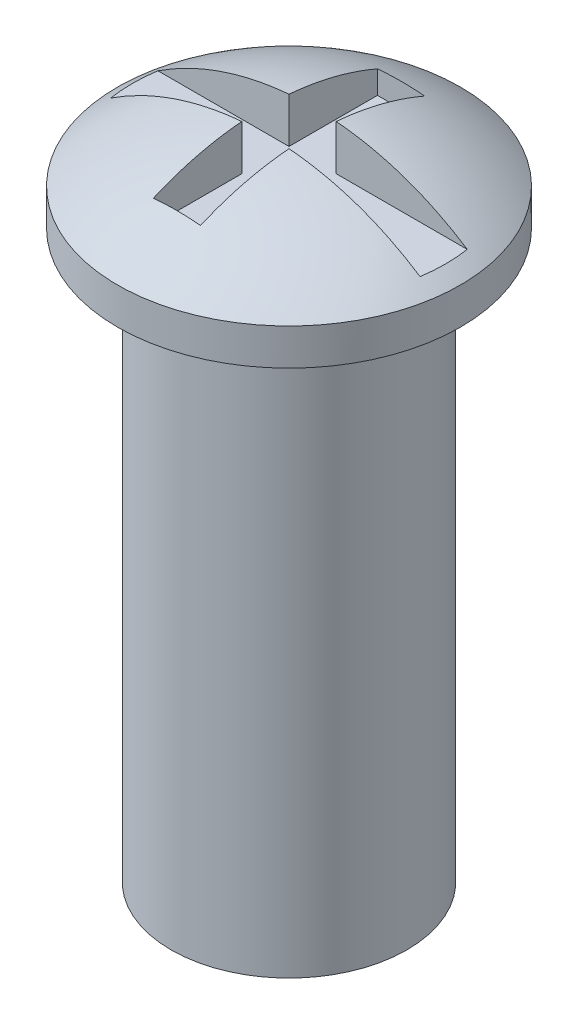
ISO-10303-21;
HEADER;
FILE_DESCRIPTION(('STEP AP214'),'2;1');
FILE_NAME('part.step','',(''),(''),'','','');
FILE_SCHEMA(('AUTOMOTIVE_DESIGN { 1 0 10303 214 1 1 1 1 }'));
ENDSEC;
DATA;
#1=APPLICATION_CONTEXT('core data for automotive mechanical design processes');
#2=APPLICATION_PROTOCOL_DEFINITION('international standard','automotive_design',2000,#1);
#3=PRODUCT_CONTEXT('',#1,'mechanical');
#4=PRODUCT('Part','Part','',(#3));
#5=PRODUCT_RELATED_PRODUCT_CATEGORY('part','',(#4));
#6=PRODUCT_DEFINITION_FORMATION('','',#4);
#7=PRODUCT_DEFINITION_CONTEXT('part definition',#1,'design');
#8=PRODUCT_DEFINITION('design','',#6,#7);
#9=PRODUCT_DEFINITION_SHAPE('','',#8);
#10=(LENGTH_UNIT() NAMED_UNIT(*) SI_UNIT(.MILLI.,.METRE.));
#11=(NAMED_UNIT(*) PLANE_ANGLE_UNIT() SI_UNIT($,.RADIAN.));
#12=(NAMED_UNIT(*) SI_UNIT($,.STERADIAN.) SOLID_ANGLE_UNIT());
#13=UNCERTAINTY_MEASURE_WITH_UNIT(LENGTH_MEASURE(1.E-05),#10,'distance_accuracy_value','');
#14=(GEOMETRIC_REPRESENTATION_CONTEXT(3) GLOBAL_UNCERTAINTY_ASSIGNED_CONTEXT((#13)) GLOBAL_UNIT_ASSIGNED_CONTEXT((#10,
#11,#12)) REPRESENTATION_CONTEXT('',''));
#15=CARTESIAN_POINT('',(0.,0.,0.));
#16=DIRECTION('',(0.,0.,1.));
#17=DIRECTION('',(1.,0.,0.));
#18=AXIS2_PLACEMENT_3D('',#15,#16,#17);
#19=CARTESIAN_POINT('',(0.,14.,0.));
#20=DIRECTION('',(0.,-1.,0.));
#21=DIRECTION('',(0.,0.,-1.));
#22=AXIS2_PLACEMENT_3D('',#19,#20,#21);
#23=CYLINDRICAL_SURFACE('',#22,3.635);
#24=CARTESIAN_POINT('',(0.,12.,0.));
#25=DIRECTION('',(0.,1.,0.));
#26=DIRECTION('',(0.,0.,1.));
#27=AXIS2_PLACEMENT_3D('',#24,#25,#26);
#28=CIRCLE('',#27,3.635);
#29=CARTESIAN_POINT('',(0.,12.,3.635));
#30=VERTEX_POINT('',#29);
#31=EDGE_CURVE('E149',#30,#30,#28,.T.);
#32=ORIENTED_EDGE('',*,*,#31,.T.);
#33=EDGE_LOOP('',(#32));
#34=FACE_BOUND('',#33,.T.);
#35=CARTESIAN_POINT('',(0.,12.7735495179164,0.));
#36=DIRECTION('',(0.,-1.,0.));
#37=DIRECTION('',(0.,0.,-1.));
#38=AXIS2_PLACEMENT_3D('',#35,#36,#37);
#39=CIRCLE('',#38,3.635);
#40=CARTESIAN_POINT('',(0.,12.7735495179164,-3.635));
#41=VERTEX_POINT('',#40);
#42=EDGE_CURVE('E175',#41,#41,#39,.F.);
#43=ORIENTED_EDGE('',*,*,#42,.F.);
#44=EDGE_LOOP('',(#43));
#45=FACE_BOUND('',#44,.T.);
#46=ADVANCED_FACE('F33',(#34,#45),#23,.T.);
#47=CARTESIAN_POINT('',(0.,12.,0.));
#48=DIRECTION('',(0.,-1.,0.));
#49=DIRECTION('',(0.,0.,-1.));
#50=AXIS2_PLACEMENT_3D('',#47,#48,#49);
#51=CYLINDRICAL_SURFACE('',#50,2.5);
#52=CARTESIAN_POINT('',(0.,12.,0.));
#53=DIRECTION('',(0.,1.,0.));
#54=DIRECTION('',(0.,0.,1.));
#55=AXIS2_PLACEMENT_3D('',#52,#53,#54);
#56=CIRCLE('',#55,2.5);
#57=CARTESIAN_POINT('',(0.,12.,2.5));
#58=VERTEX_POINT('',#57);
#59=EDGE_CURVE('E153',#58,#58,#56,.T.);
#60=ORIENTED_EDGE('',*,*,#59,.F.);
#61=EDGE_LOOP('',(#60));
#62=FACE_BOUND('',#61,.T.);
#63=CARTESIAN_POINT('',(0.,0.,0.));
#64=DIRECTION('',(0.,1.,0.));
#65=DIRECTION('',(0.,0.,1.));
#66=AXIS2_PLACEMENT_3D('',#63,#64,#65);
#67=CIRCLE('',#66,2.5);
#68=CARTESIAN_POINT('',(0.,0.,2.5));
#69=VERTEX_POINT('',#68);
#70=EDGE_CURVE('E152',#69,#69,#67,.T.);
#71=ORIENTED_EDGE('',*,*,#70,.T.);
#72=EDGE_LOOP('',(#71));
#73=FACE_BOUND('',#72,.T.);
#74=ADVANCED_FACE('F35',(#62,#73),#51,.T.);
#75=CARTESIAN_POINT('',(0.,0.,0.));
#76=DIRECTION('',(0.,1.,0.));
#77=DIRECTION('',(0.,0.,1.));
#78=AXIS2_PLACEMENT_3D('',#75,#76,#77);
#79=PLANE('',#78);
#80=ORIENTED_EDGE('',*,*,#70,.F.);
#81=EDGE_LOOP('',(#80));
#82=FACE_BOUND('',#81,.T.);
#83=ADVANCED_FACE('F239',(#82),#79,.F.);
#84=CARTESIAN_POINT('',(0.,12.,0.));
#85=DIRECTION('',(0.,1.,0.));
#86=DIRECTION('',(0.,0.,1.));
#87=AXIS2_PLACEMENT_3D('',#84,#85,#86);
#88=PLANE('',#87);
#89=ORIENTED_EDGE('',*,*,#31,.F.);
#90=EDGE_LOOP('',(#89));
#91=FACE_BOUND('',#90,.T.);
#92=ORIENTED_EDGE('',*,*,#59,.T.);
#93=EDGE_LOOP('',(#92));
#94=FACE_BOUND('',#93,.T.);
#95=ADVANCED_FACE('F242',(#91,#94),#88,.F.);
#96=CARTESIAN_POINT('',(0.,8.,0.));
#97=DIRECTION('',(0.,-1.,0.));
#98=DIRECTION('',(0.,0.,1.));
#99=AXIS2_PLACEMENT_3D('',#96,#97,#98);
#100=SPHERICAL_SURFACE('',#99,6.);
#101=CARTESIAN_POINT('',(0.,8.,2.375));
#102=DIRECTION('',(0.,0.,1.));
#103=DIRECTION('',(1.,0.,0.));
#104=AXIS2_PLACEMENT_3D('',#101,#102,#103);
#105=CIRCLE('',#104,5.50993421013355);
#106=CARTESIAN_POINT('',(0.499999999999999,13.487201016912,2.375));
#107=VERTEX_POINT('',#106);
#108=CARTESIAN_POINT('',(-0.499999999999999,13.487201016912,2.375));
#109=VERTEX_POINT('',#108);
#110=EDGE_CURVE('E179',#107,#109,#105,.T.);
#111=ORIENTED_EDGE('',*,*,#110,.T.);
#112=CARTESIAN_POINT('',(-0.5,8.,0.));
#113=DIRECTION('',(-1.,0.,0.));
#114=DIRECTION('',(0.,0.,1.));
#115=AXIS2_PLACEMENT_3D('',#112,#113,#114);
#116=CIRCLE('',#115,5.9791303715507);
#117=CARTESIAN_POINT('',(-0.5,13.9581876439065,0.5));
#118=VERTEX_POINT('',#117);
#119=EDGE_CURVE('E204',#109,#118,#116,.T.);
#120=ORIENTED_EDGE('',*,*,#119,.T.);
#121=CARTESIAN_POINT('',(0.,8.,0.5));
#122=DIRECTION('',(0.,0.,1.));
#123=DIRECTION('',(1.,0.,0.));
#124=AXIS2_PLACEMENT_3D('',#121,#122,#123);
#125=CIRCLE('',#124,5.9791303715507);
#126=CARTESIAN_POINT('',(-3.278719262151,13.,0.5));
#127=VERTEX_POINT('',#126);
#128=EDGE_CURVE('E167',#118,#127,#125,.T.);
#129=ORIENTED_EDGE('',*,*,#128,.T.);
#130=CARTESIAN_POINT('',(0.,13.,0.));
#131=DIRECTION('',(0.,1.,0.));
#132=DIRECTION('',(0.,0.,1.));
#133=AXIS2_PLACEMENT_3D('',#130,#131,#132);
#134=CIRCLE('',#133,3.3166247903554);
#135=CARTESIAN_POINT('',(-3.278719262151,13.,-0.5));
#136=VERTEX_POINT('',#135);
#137=EDGE_CURVE('E197',#136,#127,#134,.T.);
#138=ORIENTED_EDGE('',*,*,#137,.F.);
#139=CARTESIAN_POINT('',(0.,8.,-0.5));
#140=DIRECTION('',(0.,0.,-1.));
#141=DIRECTION('',(-1.,0.,0.));
#142=AXIS2_PLACEMENT_3D('',#139,#140,#141);
#143=CIRCLE('',#142,5.9791303715507);
#144=CARTESIAN_POINT('',(-0.5,13.9581876439065,-0.5));
#145=VERTEX_POINT('',#144);
#146=EDGE_CURVE('E195',#136,#145,#143,.T.);
#147=ORIENTED_EDGE('',*,*,#146,.T.);
#148=CARTESIAN_POINT('',(-0.5,8.,0.));
#149=DIRECTION('',(-1.,0.,0.));
#150=DIRECTION('',(0.,0.,1.));
#151=AXIS2_PLACEMENT_3D('',#148,#149,#150);
#152=CIRCLE('',#151,5.9791303715507);
#153=CARTESIAN_POINT('',(-0.5,13.487201016912,-2.375));
#154=VERTEX_POINT('',#153);
#155=EDGE_CURVE('E47',#145,#154,#152,.T.);
#156=ORIENTED_EDGE('',*,*,#155,.T.);
#157=CARTESIAN_POINT('',(0.,8.,-2.375));
#158=DIRECTION('',(0.,0.,-1.));
#159=DIRECTION('',(-1.,0.,0.));
#160=AXIS2_PLACEMENT_3D('',#157,#158,#159);
#161=CIRCLE('',#160,5.50993421013355);
#162=CARTESIAN_POINT('',(0.5,13.487201016912,-2.375));
#163=VERTEX_POINT('',#162);
#164=EDGE_CURVE('E11',#154,#163,#161,.T.);
#165=ORIENTED_EDGE('',*,*,#164,.T.);
#166=CARTESIAN_POINT('',(0.5,8.,0.));
#167=DIRECTION('',(1.,0.,0.));
#168=DIRECTION('',(0.,0.,-1.));
#169=AXIS2_PLACEMENT_3D('',#166,#167,#168);
#170=CIRCLE('',#169,5.9791303715507);
#171=CARTESIAN_POINT('',(0.5,13.9581876439065,-0.5));
#172=VERTEX_POINT('',#171);
#173=EDGE_CURVE('E111',#163,#172,#170,.T.);
#174=ORIENTED_EDGE('',*,*,#173,.T.);
#175=CARTESIAN_POINT('',(0.,8.,-0.5));
#176=DIRECTION('',(0.,0.,-1.));
#177=DIRECTION('',(-1.,0.,0.));
#178=AXIS2_PLACEMENT_3D('',#175,#176,#177);
#179=CIRCLE('',#178,5.9791303715507);
#180=CARTESIAN_POINT('',(3.278719262151,13.,-0.5));
#181=VERTEX_POINT('',#180);
#182=EDGE_CURVE('E193',#172,#181,#179,.T.);
#183=ORIENTED_EDGE('',*,*,#182,.T.);
#184=CARTESIAN_POINT('',(3.278719262151,13.,0.5));
#185=VERTEX_POINT('',#184);
#186=EDGE_CURVE('E190',#185,#181,#134,.T.);
#187=ORIENTED_EDGE('',*,*,#186,.F.);
#188=CARTESIAN_POINT('',(0.,8.,0.5));
#189=DIRECTION('',(0.,0.,1.));
#190=DIRECTION('',(1.,0.,0.));
#191=AXIS2_PLACEMENT_3D('',#188,#189,#190);
#192=CIRCLE('',#191,5.9791303715507);
#193=CARTESIAN_POINT('',(0.5,13.9581876439065,0.5));
#194=VERTEX_POINT('',#193);
#195=EDGE_CURVE('E201',#185,#194,#192,.T.);
#196=ORIENTED_EDGE('',*,*,#195,.T.);
#197=CARTESIAN_POINT('',(0.5,8.,0.));
#198=DIRECTION('',(1.,0.,0.));
#199=DIRECTION('',(0.,0.,-1.));
#200=AXIS2_PLACEMENT_3D('',#197,#198,#199);
#201=CIRCLE('',#200,5.9791303715507);
#202=EDGE_CURVE('E206',#194,#107,#201,.T.);
#203=ORIENTED_EDGE('',*,*,#202,.T.);
#204=EDGE_LOOP('',(#111,#120,#129,#138,#147,#156,#165,#174,#183,#187,#196,#203));
#205=FACE_BOUND('',#204,.T.);
#206=ORIENTED_EDGE('',*,*,#42,.T.);
#207=EDGE_LOOP('',(#206));
#208=FACE_BOUND('',#207,.T.);
#209=ADVANCED_FACE('F109',(#205,#208),#100,.T.);
#210=CARTESIAN_POINT('',(-0.5,13.,-2.375));
#211=DIRECTION('',(0.,0.,-1.));
#212=DIRECTION('',(-1.,0.,0.));
#213=AXIS2_PLACEMENT_3D('',#210,#211,#212);
#214=PLANE('',#213);
#215=ORIENTED_EDGE('',*,*,#164,.F.);
#216=DIRECTION('',(0.,1.,0.));
#217=VECTOR('',#216,1.);
#218=CARTESIAN_POINT('',(-0.5,13.,-2.375));
#219=LINE('',#218,#217);
#220=CARTESIAN_POINT('',(-0.5,13.,-2.375));
#221=VERTEX_POINT('',#220);
#222=EDGE_CURVE('E128',#221,#154,#219,.T.);
#223=ORIENTED_EDGE('',*,*,#222,.F.);
#224=DIRECTION('',(-1.,0.,0.));
#225=VECTOR('',#224,1.);
#226=CARTESIAN_POINT('',(-0.5,13.,-2.375));
#227=LINE('',#226,#225);
#228=CARTESIAN_POINT('',(0.5,13.,-2.375));
#229=VERTEX_POINT('',#228);
#230=EDGE_CURVE('E127',#229,#221,#227,.T.);
#231=ORIENTED_EDGE('',*,*,#230,.F.);
#232=DIRECTION('',(0.,1.,0.));
#233=VECTOR('',#232,1.);
#234=CARTESIAN_POINT('',(0.5,13.,-2.375));
#235=LINE('',#234,#233);
#236=EDGE_CURVE('E121',#229,#163,#235,.T.);
#237=ORIENTED_EDGE('',*,*,#236,.T.);
#238=EDGE_LOOP('',(#215,#223,#231,#237));
#239=FACE_BOUND('',#238,.T.);
#240=ADVANCED_FACE('F126',(#239),#214,.F.);
#241=CARTESIAN_POINT('',(0.5,13.,-2.375));
#242=DIRECTION('',(1.,0.,0.));
#243=DIRECTION('',(0.,0.,-1.));
#244=AXIS2_PLACEMENT_3D('',#241,#242,#243);
#245=PLANE('',#244);
#246=ORIENTED_EDGE('',*,*,#173,.F.);
#247=ORIENTED_EDGE('',*,*,#236,.F.);
#248=DIRECTION('',(0.,0.,-1.));
#249=VECTOR('',#248,1.);
#250=CARTESIAN_POINT('',(0.5,13.,-2.375));
#251=LINE('',#250,#249);
#252=CARTESIAN_POINT('',(0.5,13.,-0.5));
#253=VERTEX_POINT('',#252);
#254=EDGE_CURVE('E184',#253,#229,#251,.T.);
#255=ORIENTED_EDGE('',*,*,#254,.F.);
#256=DIRECTION('',(0.,-1.,0.));
#257=VECTOR('',#256,1.);
#258=CARTESIAN_POINT('',(0.5,13.,-0.5));
#259=LINE('',#258,#257);
#260=EDGE_CURVE('E124',#172,#253,#259,.T.);
#261=ORIENTED_EDGE('',*,*,#260,.F.);
#262=EDGE_LOOP('',(#246,#247,#255,#261));
#263=FACE_BOUND('',#262,.T.);
#264=ADVANCED_FACE('F119',(#263),#245,.F.);
#265=CARTESIAN_POINT('',(-0.5,13.,-2.375));
#266=DIRECTION('',(-1.,0.,0.));
#267=DIRECTION('',(0.,0.,1.));
#268=AXIS2_PLACEMENT_3D('',#265,#266,#267);
#269=PLANE('',#268);
#270=ORIENTED_EDGE('',*,*,#155,.F.);
#271=DIRECTION('',(0.,1.,0.));
#272=VECTOR('',#271,1.);
#273=CARTESIAN_POINT('',(-0.5,13.,-0.5));
#274=LINE('',#273,#272);
#275=CARTESIAN_POINT('',(-0.5,13.,-0.5));
#276=VERTEX_POINT('',#275);
#277=EDGE_CURVE('E140',#276,#145,#274,.T.);
#278=ORIENTED_EDGE('',*,*,#277,.F.);
#279=DIRECTION('',(0.,0.,1.));
#280=VECTOR('',#279,1.);
#281=CARTESIAN_POINT('',(-0.5,13.,-2.375));
#282=LINE('',#281,#280);
#283=EDGE_CURVE('E55',#221,#276,#282,.T.);
#284=ORIENTED_EDGE('',*,*,#283,.F.);
#285=ORIENTED_EDGE('',*,*,#222,.T.);
#286=EDGE_LOOP('',(#270,#278,#284,#285));
#287=FACE_BOUND('',#286,.T.);
#288=ADVANCED_FACE('F266',(#287),#269,.F.);
#289=CARTESIAN_POINT('',(-5.38604232171268,13.,-0.5));
#290=DIRECTION('',(0.,0.,-1.));
#291=DIRECTION('',(-1.,0.,0.));
#292=AXIS2_PLACEMENT_3D('',#289,#290,#291);
#293=PLANE('',#292);
#294=ORIENTED_EDGE('',*,*,#182,.F.);
#295=ORIENTED_EDGE('',*,*,#260,.T.);
#296=DIRECTION('',(-1.,0.,0.));
#297=VECTOR('',#296,1.);
#298=CARTESIAN_POINT('',(-5.38604232171268,13.,-0.5));
#299=LINE('',#298,#297);
#300=EDGE_CURVE('E147',#181,#253,#299,.T.);
#301=ORIENTED_EDGE('',*,*,#300,.F.);
#302=EDGE_LOOP('',(#294,#295,#301));
#303=FACE_BOUND('',#302,.T.);
#304=ADVANCED_FACE('F192',(#303),#293,.F.);
#305=CARTESIAN_POINT('',(-0.499999999999999,13.,2.375));
#306=DIRECTION('',(0.,0.,1.));
#307=DIRECTION('',(1.,0.,0.));
#308=AXIS2_PLACEMENT_3D('',#305,#306,#307);
#309=PLANE('',#308);
#310=ORIENTED_EDGE('',*,*,#110,.F.);
#311=DIRECTION('',(0.,1.,0.));
#312=VECTOR('',#311,1.);
#313=CARTESIAN_POINT('',(0.499999999999999,13.,2.375));
#314=LINE('',#313,#312);
#315=CARTESIAN_POINT('',(0.499999999999999,13.,2.375));
#316=VERTEX_POINT('',#315);
#317=EDGE_CURVE('E129',#316,#107,#314,.T.);
#318=ORIENTED_EDGE('',*,*,#317,.F.);
#319=DIRECTION('',(1.,0.,0.));
#320=VECTOR('',#319,1.);
#321=CARTESIAN_POINT('',(-0.499999999999999,13.,2.375));
#322=LINE('',#321,#320);
#323=CARTESIAN_POINT('',(-0.499999999999999,13.,2.375));
#324=VERTEX_POINT('',#323);
#325=EDGE_CURVE('E177',#324,#316,#322,.T.);
#326=ORIENTED_EDGE('',*,*,#325,.F.);
#327=DIRECTION('',(0.,1.,0.));
#328=VECTOR('',#327,1.);
#329=CARTESIAN_POINT('',(-0.499999999999999,13.,2.375));
#330=LINE('',#329,#328);
#331=EDGE_CURVE('E133',#324,#109,#330,.T.);
#332=ORIENTED_EDGE('',*,*,#331,.T.);
#333=EDGE_LOOP('',(#310,#318,#326,#332));
#334=FACE_BOUND('',#333,.T.);
#335=ADVANCED_FACE('F210',(#334),#309,.F.);
#336=ORIENTED_EDGE('',*,*,#119,.F.);
#337=ORIENTED_EDGE('',*,*,#331,.F.);
#338=CARTESIAN_POINT('',(-0.499999999999999,13.,0.5));
#339=VERTEX_POINT('',#338);
#340=EDGE_CURVE('E171',#339,#324,#282,.T.);
#341=ORIENTED_EDGE('',*,*,#340,.F.);
#342=DIRECTION('',(0.,-1.,0.));
#343=VECTOR('',#342,1.);
#344=CARTESIAN_POINT('',(-0.5,13.,0.5));
#345=LINE('',#344,#343);
#346=EDGE_CURVE('E41',#118,#339,#345,.T.);
#347=ORIENTED_EDGE('',*,*,#346,.F.);
#348=EDGE_LOOP('',(#336,#337,#341,#347));
#349=FACE_BOUND('',#348,.T.);
#350=ADVANCED_FACE('F172',(#349),#269,.F.);
#351=ORIENTED_EDGE('',*,*,#202,.F.);
#352=DIRECTION('',(0.,1.,0.));
#353=VECTOR('',#352,1.);
#354=CARTESIAN_POINT('',(0.5,13.,0.5));
#355=LINE('',#354,#353);
#356=CARTESIAN_POINT('',(0.5,13.,0.5));
#357=VERTEX_POINT('',#356);
#358=EDGE_CURVE('E156',#357,#194,#355,.T.);
#359=ORIENTED_EDGE('',*,*,#358,.F.);
#360=EDGE_CURVE('E185',#316,#357,#251,.T.);
#361=ORIENTED_EDGE('',*,*,#360,.F.);
#362=ORIENTED_EDGE('',*,*,#317,.T.);
#363=EDGE_LOOP('',(#351,#359,#361,#362));
#364=FACE_BOUND('',#363,.T.);
#365=ADVANCED_FACE('F215',(#364),#245,.F.);
#366=CARTESIAN_POINT('',(-5.38604232171268,13.,0.5));
#367=DIRECTION('',(0.,0.,1.));
#368=DIRECTION('',(1.,0.,0.));
#369=AXIS2_PLACEMENT_3D('',#366,#367,#368);
#370=PLANE('',#369);
#371=ORIENTED_EDGE('',*,*,#195,.F.);
#372=DIRECTION('',(1.,0.,0.));
#373=VECTOR('',#372,1.);
#374=CARTESIAN_POINT('',(-5.38604232171268,13.,0.5));
#375=LINE('',#374,#373);
#376=EDGE_CURVE('E143',#357,#185,#375,.T.);
#377=ORIENTED_EDGE('',*,*,#376,.F.);
#378=ORIENTED_EDGE('',*,*,#358,.T.);
#379=EDGE_LOOP('',(#371,#377,#378));
#380=FACE_BOUND('',#379,.T.);
#381=ADVANCED_FACE('F218',(#380),#370,.F.);
#382=CARTESIAN_POINT('',(-5.38604232171268,13.,0.5));
#383=DIRECTION('',(0.,1.,0.));
#384=DIRECTION('',(0.,0.,1.));
#385=AXIS2_PLACEMENT_3D('',#382,#383,#384);
#386=PLANE('',#385);
#387=ORIENTED_EDGE('',*,*,#376,.T.);
#388=ORIENTED_EDGE('',*,*,#186,.T.);
#389=ORIENTED_EDGE('',*,*,#300,.T.);
#390=ORIENTED_EDGE('',*,*,#254,.T.);
#391=ORIENTED_EDGE('',*,*,#230,.T.);
#392=ORIENTED_EDGE('',*,*,#283,.T.);
#393=EDGE_CURVE('E146',#276,#136,#299,.T.);
#394=ORIENTED_EDGE('',*,*,#393,.T.);
#395=ORIENTED_EDGE('',*,*,#137,.T.);
#396=EDGE_CURVE('E144',#127,#339,#375,.T.);
#397=ORIENTED_EDGE('',*,*,#396,.T.);
#398=ORIENTED_EDGE('',*,*,#340,.T.);
#399=ORIENTED_EDGE('',*,*,#325,.T.);
#400=ORIENTED_EDGE('',*,*,#360,.T.);
#401=EDGE_LOOP('',(#387,#388,#389,#390,#391,#392,#394,#395,#397,#398,#399,#400));
#402=FACE_BOUND('',#401,.T.);
#403=ADVANCED_FACE('F187',(#402),#386,.T.);
#404=ORIENTED_EDGE('',*,*,#128,.F.);
#405=ORIENTED_EDGE('',*,*,#346,.T.);
#406=ORIENTED_EDGE('',*,*,#396,.F.);
#407=EDGE_LOOP('',(#404,#405,#406));
#408=FACE_BOUND('',#407,.T.);
#409=ADVANCED_FACE('F166',(#408),#370,.F.);
#410=ORIENTED_EDGE('',*,*,#146,.F.);
#411=ORIENTED_EDGE('',*,*,#393,.F.);
#412=ORIENTED_EDGE('',*,*,#277,.T.);
#413=EDGE_LOOP('',(#410,#411,#412));
#414=FACE_BOUND('',#413,.T.);
#415=ADVANCED_FACE('F230',(#414),#293,.F.);
#416=CLOSED_SHELL('',(#46,#74,#83,#95,#209,#240,#264,#288,#304,#335,#350,#365,#381,#403,#409,#415));
#417=MANIFOLD_SOLID_BREP('B2',#416);
#418=ADVANCED_BREP_SHAPE_REPRESENTATION('',(#18,#417),#14);
#419=SHAPE_DEFINITION_REPRESENTATION(#9,#418);
ENDSEC;
END-ISO-10303-21;
